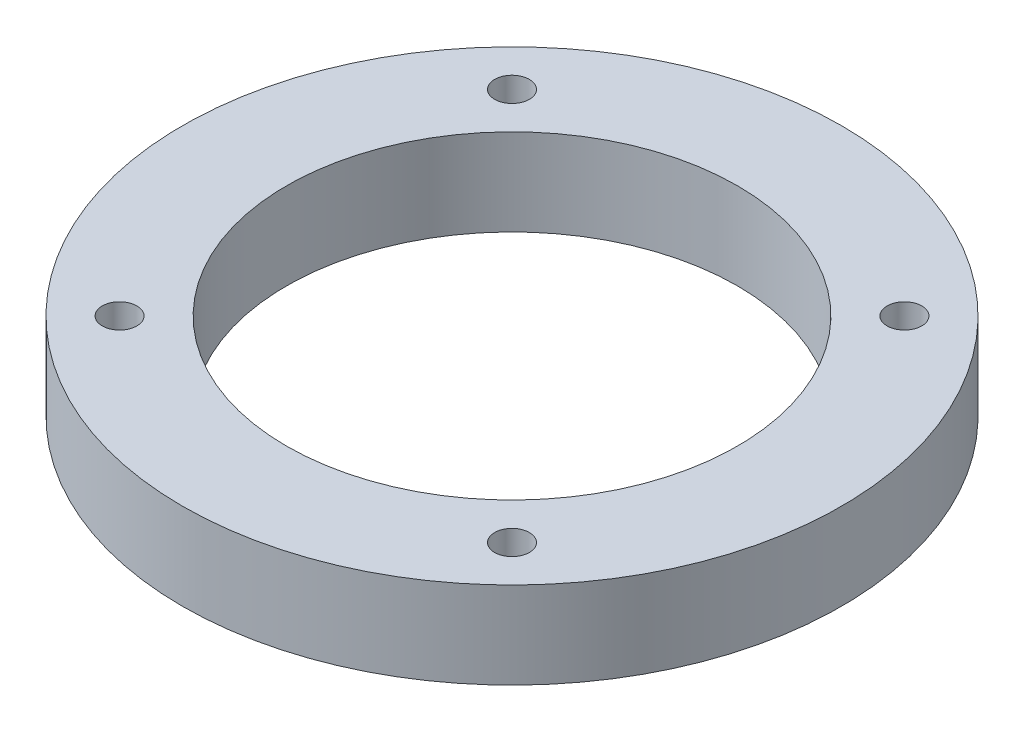
ISO-10303-21;
HEADER;
FILE_DESCRIPTION(('STEP AP214'),'2;1');
FILE_NAME('part.step','',(''),(''),'','','');
FILE_SCHEMA(('AUTOMOTIVE_DESIGN { 1 0 10303 214 1 1 1 1 }'));
ENDSEC;
DATA;
#1=APPLICATION_CONTEXT('core data for automotive mechanical design processes');
#2=APPLICATION_PROTOCOL_DEFINITION('international standard','automotive_design',2000,#1);
#3=PRODUCT_CONTEXT('',#1,'mechanical');
#4=PRODUCT('Part','Part','',(#3));
#5=PRODUCT_RELATED_PRODUCT_CATEGORY('part','',(#4));
#6=PRODUCT_DEFINITION_FORMATION('','',#4);
#7=PRODUCT_DEFINITION_CONTEXT('part definition',#1,'design');
#8=PRODUCT_DEFINITION('design','',#6,#7);
#9=PRODUCT_DEFINITION_SHAPE('','',#8);
#10=(LENGTH_UNIT() NAMED_UNIT(*) SI_UNIT(.MILLI.,.METRE.));
#11=(NAMED_UNIT(*) PLANE_ANGLE_UNIT() SI_UNIT($,.RADIAN.));
#12=(NAMED_UNIT(*) SI_UNIT($,.STERADIAN.) SOLID_ANGLE_UNIT());
#13=UNCERTAINTY_MEASURE_WITH_UNIT(LENGTH_MEASURE(1.E-05),#10,'distance_accuracy_value','');
#14=(GEOMETRIC_REPRESENTATION_CONTEXT(3) GLOBAL_UNCERTAINTY_ASSIGNED_CONTEXT((#13)) GLOBAL_UNIT_ASSIGNED_CONTEXT((#10,
#11,#12)) REPRESENTATION_CONTEXT('',''));
#15=CARTESIAN_POINT('',(0.,0.,0.));
#16=DIRECTION('',(0.,0.,1.));
#17=DIRECTION('',(1.,0.,0.));
#18=AXIS2_PLACEMENT_3D('',#15,#16,#17);
#19=CARTESIAN_POINT('',(0.,10.,0.));
#20=DIRECTION('',(0.,1.,0.));
#21=DIRECTION('',(0.,0.,1.));
#22=AXIS2_PLACEMENT_3D('',#19,#20,#21);
#23=PLANE('',#22);
#24=CARTESIAN_POINT('',(22.625,10.,22.625));
#25=DIRECTION('',(0.,1.,0.));
#26=DIRECTION('',(0.,0.,1.));
#27=AXIS2_PLACEMENT_3D('',#24,#25,#26);
#28=CIRCLE('',#27,2.);
#29=CARTESIAN_POINT('',(22.625,10.,24.625));
#30=VERTEX_POINT('',#29);
#31=EDGE_CURVE('E78',#30,#30,#28,.T.);
#32=ORIENTED_EDGE('',*,*,#31,.F.);
#33=EDGE_LOOP('',(#32));
#34=FACE_BOUND('',#33,.T.);
#35=CARTESIAN_POINT('',(-22.625,10.,-22.625));
#36=DIRECTION('',(0.,1.,0.));
#37=DIRECTION('',(0.,0.,1.));
#38=AXIS2_PLACEMENT_3D('',#35,#36,#37);
#39=CIRCLE('',#38,2.);
#40=CARTESIAN_POINT('',(-22.625,10.,-20.625));
#41=VERTEX_POINT('',#40);
#42=EDGE_CURVE('E62',#41,#41,#39,.T.);
#43=ORIENTED_EDGE('',*,*,#42,.F.);
#44=EDGE_LOOP('',(#43));
#45=FACE_BOUND('',#44,.T.);
#46=CARTESIAN_POINT('',(0.,10.,0.));
#47=DIRECTION('',(0.,1.,0.));
#48=DIRECTION('',(0.,0.,1.));
#49=AXIS2_PLACEMENT_3D('',#46,#47,#48);
#50=CIRCLE('',#49,38.);
#51=CARTESIAN_POINT('',(0.,10.,38.));
#52=VERTEX_POINT('',#51);
#53=EDGE_CURVE('E10',#52,#52,#50,.T.);
#54=ORIENTED_EDGE('',*,*,#53,.T.);
#55=EDGE_LOOP('',(#54));
#56=FACE_BOUND('',#55,.T.);
#57=CARTESIAN_POINT('',(0.,10.,0.));
#58=DIRECTION('',(0.,1.,0.));
#59=DIRECTION('',(0.,0.,1.));
#60=AXIS2_PLACEMENT_3D('',#57,#58,#59);
#61=CIRCLE('',#60,26.);
#62=CARTESIAN_POINT('',(0.,10.,26.));
#63=VERTEX_POINT('',#62);
#64=EDGE_CURVE('E56',#63,#63,#61,.T.);
#65=ORIENTED_EDGE('',*,*,#64,.F.);
#66=EDGE_LOOP('',(#65));
#67=FACE_BOUND('',#66,.T.);
#68=CARTESIAN_POINT('',(22.625,10.,-22.625));
#69=DIRECTION('',(0.,1.,0.));
#70=DIRECTION('',(0.,0.,1.));
#71=AXIS2_PLACEMENT_3D('',#68,#69,#70);
#72=CIRCLE('',#71,2.);
#73=CARTESIAN_POINT('',(22.625,10.,-20.625));
#74=VERTEX_POINT('',#73);
#75=EDGE_CURVE('E70',#74,#74,#72,.T.);
#76=ORIENTED_EDGE('',*,*,#75,.F.);
#77=EDGE_LOOP('',(#76));
#78=FACE_BOUND('',#77,.T.);
#79=CARTESIAN_POINT('',(-22.625,10.,22.625));
#80=DIRECTION('',(0.,1.,0.));
#81=DIRECTION('',(0.,0.,1.));
#82=AXIS2_PLACEMENT_3D('',#79,#80,#81);
#83=CIRCLE('',#82,2.);
#84=CARTESIAN_POINT('',(-22.625,10.,24.625));
#85=VERTEX_POINT('',#84);
#86=EDGE_CURVE('E86',#85,#85,#83,.T.);
#87=ORIENTED_EDGE('',*,*,#86,.F.);
#88=EDGE_LOOP('',(#87));
#89=FACE_BOUND('',#88,.T.);
#90=ADVANCED_FACE('F43',(#34,#45,#56,#67,#78,#89),#23,.T.);
#91=CARTESIAN_POINT('',(0.,0.,0.));
#92=DIRECTION('',(0.,1.,0.));
#93=DIRECTION('',(0.,0.,1.));
#94=AXIS2_PLACEMENT_3D('',#91,#92,#93);
#95=PLANE('',#94);
#96=CARTESIAN_POINT('',(0.,0.,0.));
#97=DIRECTION('',(0.,1.,0.));
#98=DIRECTION('',(0.,0.,1.));
#99=AXIS2_PLACEMENT_3D('',#96,#97,#98);
#100=CIRCLE('',#99,38.);
#101=CARTESIAN_POINT('',(0.,0.,38.));
#102=VERTEX_POINT('',#101);
#103=EDGE_CURVE('E47',#102,#102,#100,.T.);
#104=ORIENTED_EDGE('',*,*,#103,.F.);
#105=EDGE_LOOP('',(#104));
#106=FACE_BOUND('',#105,.T.);
#107=CARTESIAN_POINT('',(0.,0.,0.));
#108=DIRECTION('',(0.,1.,0.));
#109=DIRECTION('',(0.,0.,1.));
#110=AXIS2_PLACEMENT_3D('',#107,#108,#109);
#111=CIRCLE('',#110,26.);
#112=CARTESIAN_POINT('',(0.,0.,26.));
#113=VERTEX_POINT('',#112);
#114=EDGE_CURVE('E58',#113,#113,#111,.T.);
#115=ORIENTED_EDGE('',*,*,#114,.T.);
#116=EDGE_LOOP('',(#115));
#117=FACE_BOUND('',#116,.T.);
#118=CARTESIAN_POINT('',(-22.625,0.,-22.625));
#119=DIRECTION('',(0.,1.,0.));
#120=DIRECTION('',(0.,0.,1.));
#121=AXIS2_PLACEMENT_3D('',#118,#119,#120);
#122=CIRCLE('',#121,2.);
#123=CARTESIAN_POINT('',(-22.625,0.,-20.625));
#124=VERTEX_POINT('',#123);
#125=EDGE_CURVE('E66',#124,#124,#122,.T.);
#126=ORIENTED_EDGE('',*,*,#125,.T.);
#127=EDGE_LOOP('',(#126));
#128=FACE_BOUND('',#127,.T.);
#129=CARTESIAN_POINT('',(22.625,0.,-22.625));
#130=DIRECTION('',(0.,1.,0.));
#131=DIRECTION('',(0.,0.,1.));
#132=AXIS2_PLACEMENT_3D('',#129,#130,#131);
#133=CIRCLE('',#132,2.);
#134=CARTESIAN_POINT('',(22.625,0.,-20.625));
#135=VERTEX_POINT('',#134);
#136=EDGE_CURVE('E74',#135,#135,#133,.T.);
#137=ORIENTED_EDGE('',*,*,#136,.T.);
#138=EDGE_LOOP('',(#137));
#139=FACE_BOUND('',#138,.T.);
#140=CARTESIAN_POINT('',(22.625,0.,22.625));
#141=DIRECTION('',(0.,1.,0.));
#142=DIRECTION('',(0.,0.,1.));
#143=AXIS2_PLACEMENT_3D('',#140,#141,#142);
#144=CIRCLE('',#143,2.);
#145=CARTESIAN_POINT('',(22.625,0.,24.625));
#146=VERTEX_POINT('',#145);
#147=EDGE_CURVE('E82',#146,#146,#144,.T.);
#148=ORIENTED_EDGE('',*,*,#147,.T.);
#149=EDGE_LOOP('',(#148));
#150=FACE_BOUND('',#149,.T.);
#151=CARTESIAN_POINT('',(-22.625,0.,22.625));
#152=DIRECTION('',(0.,1.,0.));
#153=DIRECTION('',(0.,0.,1.));
#154=AXIS2_PLACEMENT_3D('',#151,#152,#153);
#155=CIRCLE('',#154,2.);
#156=CARTESIAN_POINT('',(-22.625,0.,24.625));
#157=VERTEX_POINT('',#156);
#158=EDGE_CURVE('E90',#157,#157,#155,.T.);
#159=ORIENTED_EDGE('',*,*,#158,.T.);
#160=EDGE_LOOP('',(#159));
#161=FACE_BOUND('',#160,.T.);
#162=ADVANCED_FACE('F102',(#106,#117,#128,#139,#150,#161),#95,.F.);
#163=CARTESIAN_POINT('',(0.,10.,0.));
#164=DIRECTION('',(0.,-1.,0.));
#165=DIRECTION('',(0.,0.,-1.));
#166=AXIS2_PLACEMENT_3D('',#163,#164,#165);
#167=CYLINDRICAL_SURFACE('',#166,38.);
#168=ORIENTED_EDGE('',*,*,#53,.F.);
#169=EDGE_LOOP('',(#168));
#170=FACE_BOUND('',#169,.T.);
#171=ORIENTED_EDGE('',*,*,#103,.T.);
#172=EDGE_LOOP('',(#171));
#173=FACE_BOUND('',#172,.T.);
#174=ADVANCED_FACE('F45',(#170,#173),#167,.T.);
#175=CARTESIAN_POINT('',(0.,10.,0.));
#176=DIRECTION('',(0.,-1.,0.));
#177=DIRECTION('',(0.,0.,-1.));
#178=AXIS2_PLACEMENT_3D('',#175,#176,#177);
#179=CYLINDRICAL_SURFACE('',#178,26.);
#180=ORIENTED_EDGE('',*,*,#64,.T.);
#181=EDGE_LOOP('',(#180));
#182=FACE_BOUND('',#181,.T.);
#183=ORIENTED_EDGE('',*,*,#114,.F.);
#184=EDGE_LOOP('',(#183));
#185=FACE_BOUND('',#184,.T.);
#186=ADVANCED_FACE('F112',(#182,#185),#179,.F.);
#187=CARTESIAN_POINT('',(-22.625,10.,-22.625));
#188=DIRECTION('',(0.,-1.,0.));
#189=DIRECTION('',(0.,0.,-1.));
#190=AXIS2_PLACEMENT_3D('',#187,#188,#189);
#191=CYLINDRICAL_SURFACE('',#190,2.);
#192=ORIENTED_EDGE('',*,*,#42,.T.);
#193=EDGE_LOOP('',(#192));
#194=FACE_BOUND('',#193,.T.);
#195=ORIENTED_EDGE('',*,*,#125,.F.);
#196=EDGE_LOOP('',(#195));
#197=FACE_BOUND('',#196,.T.);
#198=ADVANCED_FACE('F115',(#194,#197),#191,.F.);
#199=CARTESIAN_POINT('',(22.625,10.,-22.625));
#200=DIRECTION('',(0.,-1.,0.));
#201=DIRECTION('',(0.,0.,-1.));
#202=AXIS2_PLACEMENT_3D('',#199,#200,#201);
#203=CYLINDRICAL_SURFACE('',#202,2.);
#204=ORIENTED_EDGE('',*,*,#75,.T.);
#205=EDGE_LOOP('',(#204));
#206=FACE_BOUND('',#205,.T.);
#207=ORIENTED_EDGE('',*,*,#136,.F.);
#208=EDGE_LOOP('',(#207));
#209=FACE_BOUND('',#208,.T.);
#210=ADVANCED_FACE('F119',(#206,#209),#203,.F.);
#211=CARTESIAN_POINT('',(22.625,10.,22.625));
#212=DIRECTION('',(0.,-1.,0.));
#213=DIRECTION('',(0.,0.,-1.));
#214=AXIS2_PLACEMENT_3D('',#211,#212,#213);
#215=CYLINDRICAL_SURFACE('',#214,2.);
#216=ORIENTED_EDGE('',*,*,#31,.T.);
#217=EDGE_LOOP('',(#216));
#218=FACE_BOUND('',#217,.T.);
#219=ORIENTED_EDGE('',*,*,#147,.F.);
#220=EDGE_LOOP('',(#219));
#221=FACE_BOUND('',#220,.T.);
#222=ADVANCED_FACE('F123',(#218,#221),#215,.F.);
#223=CARTESIAN_POINT('',(-22.625,10.,22.625));
#224=DIRECTION('',(0.,-1.,0.));
#225=DIRECTION('',(0.,0.,-1.));
#226=AXIS2_PLACEMENT_3D('',#223,#224,#225);
#227=CYLINDRICAL_SURFACE('',#226,2.);
#228=ORIENTED_EDGE('',*,*,#86,.T.);
#229=EDGE_LOOP('',(#228));
#230=FACE_BOUND('',#229,.T.);
#231=ORIENTED_EDGE('',*,*,#158,.F.);
#232=EDGE_LOOP('',(#231));
#233=FACE_BOUND('',#232,.T.);
#234=ADVANCED_FACE('F98',(#230,#233),#227,.F.);
#235=CLOSED_SHELL('',(#90,#162,#174,#186,#198,#210,#222,#234));
#236=MANIFOLD_SOLID_BREP('B2',#235);
#237=ADVANCED_BREP_SHAPE_REPRESENTATION('',(#18,#236),#14);
#238=SHAPE_DEFINITION_REPRESENTATION(#9,#237);
ENDSEC;
END-ISO-10303-21;
